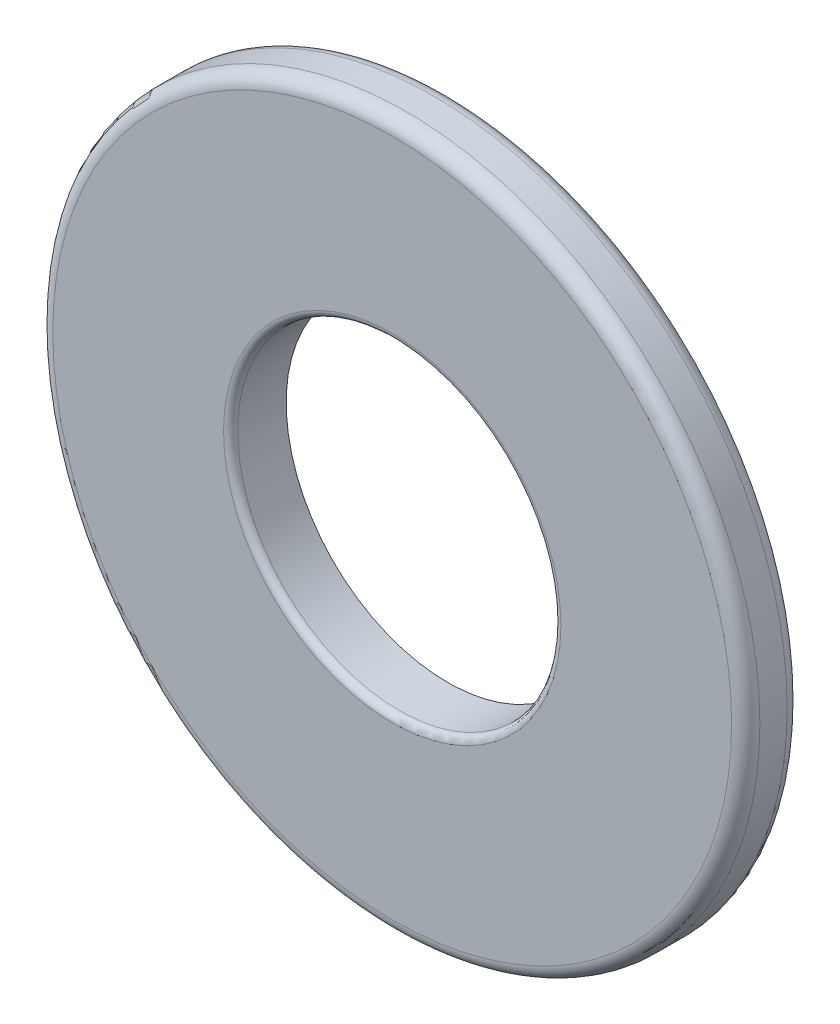
ISO-10303-21;
HEADER;
FILE_DESCRIPTION(('STEP AP214'),'2;1');
FILE_NAME('part.step','',(''),(''),'','','');
FILE_SCHEMA(('AUTOMOTIVE_DESIGN { 1 0 10303 214 1 1 1 1 }'));
ENDSEC;
DATA;
#1=APPLICATION_CONTEXT('core data for automotive mechanical design processes');
#2=APPLICATION_PROTOCOL_DEFINITION('international standard','automotive_design',2000,#1);
#3=PRODUCT_CONTEXT('',#1,'mechanical');
#4=PRODUCT('Part','Part','',(#3));
#5=PRODUCT_RELATED_PRODUCT_CATEGORY('part','',(#4));
#6=PRODUCT_DEFINITION_FORMATION('','',#4);
#7=PRODUCT_DEFINITION_CONTEXT('part definition',#1,'design');
#8=PRODUCT_DEFINITION('design','',#6,#7);
#9=PRODUCT_DEFINITION_SHAPE('','',#8);
#10=(LENGTH_UNIT() NAMED_UNIT(*) SI_UNIT(.MILLI.,.METRE.));
#11=(NAMED_UNIT(*) PLANE_ANGLE_UNIT() SI_UNIT($,.RADIAN.));
#12=(NAMED_UNIT(*) SI_UNIT($,.STERADIAN.) SOLID_ANGLE_UNIT());
#13=UNCERTAINTY_MEASURE_WITH_UNIT(LENGTH_MEASURE(1.E-05),#10,'distance_accuracy_value','');
#14=(GEOMETRIC_REPRESENTATION_CONTEXT(3) GLOBAL_UNCERTAINTY_ASSIGNED_CONTEXT((#13)) GLOBAL_UNIT_ASSIGNED_CONTEXT((#10,
#11,#12)) REPRESENTATION_CONTEXT('',''));
#15=CARTESIAN_POINT('',(0.,0.,0.));
#16=DIRECTION('',(0.,0.,1.));
#17=DIRECTION('',(1.,0.,0.));
#18=AXIS2_PLACEMENT_3D('',#15,#16,#17);
#19=CARTESIAN_POINT('',(0.,0.,-0.275));
#20=DIRECTION('',(0.,0.,1.));
#21=DIRECTION('',(1.,0.,0.));
#22=AXIS2_PLACEMENT_3D('',#19,#20,#21);
#23=CYLINDRICAL_SURFACE('',#22,3.5);
#24=CARTESIAN_POINT('',(0.,0.,0.135));
#25=DIRECTION('',(0.,0.,1.));
#26=DIRECTION('',(1.,0.,0.));
#27=AXIS2_PLACEMENT_3D('',#24,#25,#26);
#28=CIRCLE('',#27,3.5);
#29=CARTESIAN_POINT('',(3.5,0.,0.135));
#30=VERTEX_POINT('',#29);
#31=EDGE_CURVE('E101',#30,#30,#28,.F.);
#32=ORIENTED_EDGE('',*,*,#31,.T.);
#33=EDGE_LOOP('',(#32));
#34=FACE_BOUND('',#33,.T.);
#35=CARTESIAN_POINT('',(0.,0.,-0.135));
#36=DIRECTION('',(0.,0.,1.));
#37=DIRECTION('',(1.,0.,0.));
#38=AXIS2_PLACEMENT_3D('',#35,#36,#37);
#39=CIRCLE('',#38,3.5);
#40=CARTESIAN_POINT('',(3.5,0.,-0.135));
#41=VERTEX_POINT('',#40);
#42=EDGE_CURVE('E107',#41,#41,#39,.T.);
#43=ORIENTED_EDGE('',*,*,#42,.T.);
#44=EDGE_LOOP('',(#43));
#45=FACE_BOUND('',#44,.T.);
#46=ADVANCED_FACE('F83',(#34,#45),#23,.T.);
#47=CARTESIAN_POINT('',(0.,0.,-0.275));
#48=DIRECTION('',(0.,0.,1.));
#49=DIRECTION('',(1.,0.,0.));
#50=AXIS2_PLACEMENT_3D('',#47,#48,#49);
#51=PLANE('',#50);
#52=CARTESIAN_POINT('',(0.,0.,-0.275));
#53=DIRECTION('',(0.,0.,1.));
#54=DIRECTION('',(1.,0.,0.));
#55=AXIS2_PLACEMENT_3D('',#52,#53,#54);
#56=CIRCLE('',#55,3.36);
#57=CARTESIAN_POINT('',(3.36,0.,-0.275));
#58=VERTEX_POINT('',#57);
#59=EDGE_CURVE('E96',#58,#58,#56,.F.);
#60=ORIENTED_EDGE('',*,*,#59,.T.);
#61=EDGE_LOOP('',(#60));
#62=FACE_BOUND('',#61,.T.);
#63=CARTESIAN_POINT('',(0.,0.,-0.275));
#64=DIRECTION('',(0.,0.,1.));
#65=DIRECTION('',(1.,0.,0.));
#66=AXIS2_PLACEMENT_3D('',#63,#64,#65);
#67=CIRCLE('',#66,1.6);
#68=CARTESIAN_POINT('',(1.6,0.,-0.275));
#69=VERTEX_POINT('',#68);
#70=EDGE_CURVE('E115',#69,#69,#67,.T.);
#71=ORIENTED_EDGE('',*,*,#70,.T.);
#72=EDGE_LOOP('',(#71));
#73=FACE_BOUND('',#72,.T.);
#74=ADVANCED_FACE('F120',(#62,#73),#51,.F.);
#75=CARTESIAN_POINT('',(0.,0.,-0.275));
#76=DIRECTION('',(0.,0.,1.));
#77=DIRECTION('',(1.,0.,0.));
#78=AXIS2_PLACEMENT_3D('',#75,#76,#77);
#79=CYLINDRICAL_SURFACE('',#78,1.6);
#80=CARTESIAN_POINT('',(0.,0.,0.205));
#81=DIRECTION('',(0.,0.,1.));
#82=DIRECTION('',(1.,0.,0.));
#83=AXIS2_PLACEMENT_3D('',#80,#81,#82);
#84=CIRCLE('',#83,1.6);
#85=CARTESIAN_POINT('',(1.6,0.,0.205));
#86=VERTEX_POINT('',#85);
#87=EDGE_CURVE('E91',#86,#86,#84,.T.);
#88=ORIENTED_EDGE('',*,*,#87,.T.);
#89=EDGE_LOOP('',(#88));
#90=FACE_BOUND('',#89,.T.);
#91=ORIENTED_EDGE('',*,*,#70,.F.);
#92=EDGE_LOOP('',(#91));
#93=FACE_BOUND('',#92,.T.);
#94=ADVANCED_FACE('F122',(#90,#93),#79,.F.);
#95=CARTESIAN_POINT('',(0.,0.,0.275));
#96=DIRECTION('',(0.,0.,1.));
#97=DIRECTION('',(1.,0.,0.));
#98=AXIS2_PLACEMENT_3D('',#95,#96,#97);
#99=PLANE('',#98);
#100=CARTESIAN_POINT('',(0.,0.,0.275));
#101=DIRECTION('',(0.,0.,1.));
#102=DIRECTION('',(1.,0.,0.));
#103=AXIS2_PLACEMENT_3D('',#100,#101,#102);
#104=CIRCLE('',#103,1.67);
#105=CARTESIAN_POINT('',(1.67,0.,0.275));
#106=VERTEX_POINT('',#105);
#107=EDGE_CURVE('E11',#106,#106,#104,.F.);
#108=ORIENTED_EDGE('',*,*,#107,.T.);
#109=EDGE_LOOP('',(#108));
#110=FACE_BOUND('',#109,.T.);
#111=CARTESIAN_POINT('',(0.,0.,0.275));
#112=DIRECTION('',(0.,0.,1.));
#113=DIRECTION('',(1.,0.,0.));
#114=AXIS2_PLACEMENT_3D('',#111,#112,#113);
#115=CIRCLE('',#114,3.36);
#116=CARTESIAN_POINT('',(3.36,0.,0.275));
#117=VERTEX_POINT('',#116);
#118=EDGE_CURVE('E111',#117,#117,#115,.T.);
#119=ORIENTED_EDGE('',*,*,#118,.T.);
#120=EDGE_LOOP('',(#119));
#121=FACE_BOUND('',#120,.T.);
#122=ADVANCED_FACE('F124',(#110,#121),#99,.T.);
#123=CARTESIAN_POINT('',(0.,0.,0.135));
#124=DIRECTION('',(0.,0.,1.));
#125=DIRECTION('',(1.,0.,0.));
#126=AXIS2_PLACEMENT_3D('',#123,#124,#125);
#127=TOROIDAL_SURFACE('',#126,3.36,0.14);
#128=ORIENTED_EDGE('',*,*,#31,.F.);
#129=EDGE_LOOP('',(#128));
#130=FACE_BOUND('',#129,.T.);
#131=ORIENTED_EDGE('',*,*,#118,.F.);
#132=EDGE_LOOP('',(#131));
#133=FACE_BOUND('',#132,.T.);
#134=ADVANCED_FACE('F130',(#130,#133),#127,.T.);
#135=CARTESIAN_POINT('',(0.,0.,-0.135));
#136=DIRECTION('',(0.,0.,1.));
#137=DIRECTION('',(1.,0.,0.));
#138=AXIS2_PLACEMENT_3D('',#135,#136,#137);
#139=TOROIDAL_SURFACE('',#138,3.36,0.14);
#140=ORIENTED_EDGE('',*,*,#59,.F.);
#141=EDGE_LOOP('',(#140));
#142=FACE_BOUND('',#141,.T.);
#143=ORIENTED_EDGE('',*,*,#42,.F.);
#144=EDGE_LOOP('',(#143));
#145=FACE_BOUND('',#144,.T.);
#146=ADVANCED_FACE('F142',(#142,#145),#139,.T.);
#147=CARTESIAN_POINT('',(0.,0.,0.205));
#148=DIRECTION('',(0.,0.,1.));
#149=DIRECTION('',(1.,0.,0.));
#150=AXIS2_PLACEMENT_3D('',#147,#148,#149);
#151=TOROIDAL_SURFACE('',#150,1.67,0.07);
#152=ORIENTED_EDGE('',*,*,#107,.F.);
#153=EDGE_LOOP('',(#152));
#154=FACE_BOUND('',#153,.T.);
#155=ORIENTED_EDGE('',*,*,#87,.F.);
#156=EDGE_LOOP('',(#155));
#157=FACE_BOUND('',#156,.T.);
#158=ADVANCED_FACE('F85',(#154,#157),#151,.T.);
#159=CLOSED_SHELL('',(#46,#74,#94,#122,#134,#146,#158));
#160=MANIFOLD_SOLID_BREP('B2',#159);
#161=ADVANCED_BREP_SHAPE_REPRESENTATION('',(#18,#160),#14);
#162=SHAPE_DEFINITION_REPRESENTATION(#9,#161);
ENDSEC;
END-ISO-10303-21;
